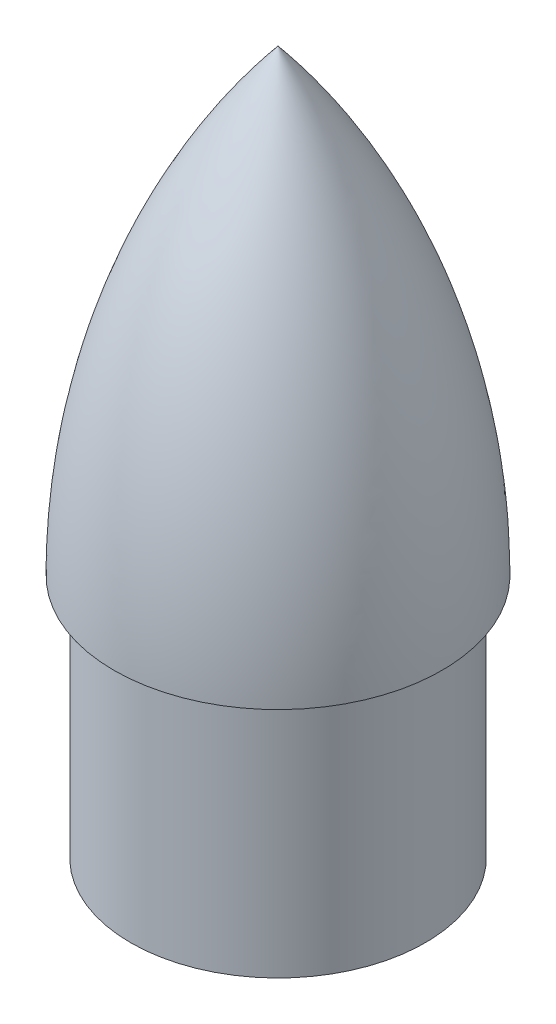
ISO-10303-21;
HEADER;
FILE_DESCRIPTION(('STEP AP214'),'2;1');
FILE_NAME('part.step','',(''),(''),'','','');
FILE_SCHEMA(('AUTOMOTIVE_DESIGN { 1 0 10303 214 1 1 1 1 }'));
ENDSEC;
DATA;
#1=APPLICATION_CONTEXT('core data for automotive mechanical design processes');
#2=APPLICATION_PROTOCOL_DEFINITION('international standard','automotive_design',2000,#1);
#3=PRODUCT_CONTEXT('',#1,'mechanical');
#4=PRODUCT('Part','Part','',(#3));
#5=PRODUCT_RELATED_PRODUCT_CATEGORY('part','',(#4));
#6=PRODUCT_DEFINITION_FORMATION('','',#4);
#7=PRODUCT_DEFINITION_CONTEXT('part definition',#1,'design');
#8=PRODUCT_DEFINITION('design','',#6,#7);
#9=PRODUCT_DEFINITION_SHAPE('','',#8);
#10=(LENGTH_UNIT() NAMED_UNIT(*) SI_UNIT(.MILLI.,.METRE.));
#11=(NAMED_UNIT(*) PLANE_ANGLE_UNIT() SI_UNIT($,.RADIAN.));
#12=(NAMED_UNIT(*) SI_UNIT($,.STERADIAN.) SOLID_ANGLE_UNIT());
#13=UNCERTAINTY_MEASURE_WITH_UNIT(LENGTH_MEASURE(1.E-05),#10,'distance_accuracy_value','');
#14=(GEOMETRIC_REPRESENTATION_CONTEXT(3) GLOBAL_UNCERTAINTY_ASSIGNED_CONTEXT((#13)) GLOBAL_UNIT_ASSIGNED_CONTEXT((#10,
#11,#12)) REPRESENTATION_CONTEXT('',''));
#15=CARTESIAN_POINT('',(0.,0.,0.));
#16=DIRECTION('',(0.,0.,1.));
#17=DIRECTION('',(1.,0.,0.));
#18=AXIS2_PLACEMENT_3D('',#15,#16,#17);
#19=CARTESIAN_POINT('',(0.,0.,0.));
#20=DIRECTION('',(0.,-1.,0.));
#21=DIRECTION('',(0.,0.,-1.));
#22=AXIS2_PLACEMENT_3D('',#19,#20,#21);
#23=PLANE('',#22);
#24=CARTESIAN_POINT('',(0.,0.,0.));
#25=DIRECTION('',(0.,-1.,0.));
#26=DIRECTION('',(0.,0.,-1.));
#27=AXIS2_PLACEMENT_3D('',#24,#25,#26);
#28=CIRCLE('',#27,30.15);
#29=CARTESIAN_POINT('',(0.,0.,-30.15));
#30=VERTEX_POINT('',#29);
#31=EDGE_CURVE('E65',#30,#30,#28,.T.);
#32=ORIENTED_EDGE('',*,*,#31,.F.);
#33=EDGE_LOOP('',(#32));
#34=FACE_BOUND('',#33,.T.);
#35=CARTESIAN_POINT('',(0.,0.,0.));
#36=DIRECTION('',(0.,-1.,0.));
#37=DIRECTION('',(0.,0.,-1.));
#38=AXIS2_PLACEMENT_3D('',#35,#36,#37);
#39=CIRCLE('',#38,33.570889043);
#40=CARTESIAN_POINT('',(0.,0.,-33.570889043));
#41=VERTEX_POINT('',#40);
#42=EDGE_CURVE('E59',#41,#41,#39,.T.);
#43=ORIENTED_EDGE('',*,*,#42,.T.);
#44=EDGE_LOOP('',(#43));
#45=FACE_BOUND('',#44,.T.);
#46=ADVANCED_FACE('F41',(#34,#45),#23,.T.);
#47=CARTESIAN_POINT('',(0.,0.,114.536814902525));
#48=DIRECTION('',(-1.,0.,0.));
#49=DIRECTION('',(0.,0.,-1.));
#50=AXIS2_PLACEMENT_3D('',#47,#48,#49);
#51=CIRCLE('',#50,148.107703945525);
#52=TRIMMED_CURVE('',#51,(PARAMETER_VALUE(-0.686712247406567)),
(PARAMETER_VALUE(0.686712247406567)),.T.,.PARAMETER.);
#53=CARTESIAN_POINT('',(0.,0.,0.));
#54=DIRECTION('',(0.,-1.,0.));
#55=AXIS1_PLACEMENT('',#53,#54);
#56=SURFACE_OF_REVOLUTION('',#52,#55);
#57=CARTESIAN_POINT('',(0.,93.9,0.));
#58=VERTEX_POINT('',#57);
#59=VERTEX_LOOP('',#58);
#60=FACE_BOUND('',#59,.T.);
#61=ORIENTED_EDGE('',*,*,#42,.F.);
#62=EDGE_LOOP('',(#61));
#63=FACE_BOUND('',#62,.T.);
#64=ADVANCED_FACE('F52',(#60,#63),#56,.T.);
#65=CARTESIAN_POINT('',(0.,-50.,0.));
#66=DIRECTION('',(0.,1.,0.));
#67=DIRECTION('',(0.,0.,1.));
#68=AXIS2_PLACEMENT_3D('',#65,#66,#67);
#69=CYLINDRICAL_SURFACE('',#68,30.15);
#70=CARTESIAN_POINT('',(0.,-50.,0.));
#71=DIRECTION('',(0.,-1.,0.));
#72=DIRECTION('',(0.,0.,-1.));
#73=AXIS2_PLACEMENT_3D('',#70,#71,#72);
#74=CIRCLE('',#73,30.15);
#75=CARTESIAN_POINT('',(0.,-50.,-30.15));
#76=VERTEX_POINT('',#75);
#77=EDGE_CURVE('E61',#76,#76,#74,.T.);
#78=ORIENTED_EDGE('',*,*,#77,.F.);
#79=EDGE_LOOP('',(#78));
#80=FACE_BOUND('',#79,.T.);
#81=ORIENTED_EDGE('',*,*,#31,.T.);
#82=EDGE_LOOP('',(#81));
#83=FACE_BOUND('',#82,.T.);
#84=ADVANCED_FACE('F55',(#80,#83),#69,.T.);
#85=CARTESIAN_POINT('',(0.,-50.,0.));
#86=DIRECTION('',(0.,-1.,0.));
#87=DIRECTION('',(0.,0.,-1.));
#88=AXIS2_PLACEMENT_3D('',#85,#86,#87);
#89=PLANE('',#88);
#90=CARTESIAN_POINT('',(0.,-50.,0.));
#91=DIRECTION('',(0.,-1.,0.));
#92=DIRECTION('',(0.,0.,-1.));
#93=AXIS2_PLACEMENT_3D('',#90,#91,#92);
#94=CIRCLE('',#93,27.75);
#95=CARTESIAN_POINT('',(0.,-50.,-27.75));
#96=VERTEX_POINT('',#95);
#97=EDGE_CURVE('E69',#96,#96,#94,.T.);
#98=ORIENTED_EDGE('',*,*,#97,.F.);
#99=EDGE_LOOP('',(#98));
#100=FACE_BOUND('',#99,.T.);
#101=ORIENTED_EDGE('',*,*,#77,.T.);
#102=EDGE_LOOP('',(#101));
#103=FACE_BOUND('',#102,.T.);
#104=ADVANCED_FACE('F76',(#100,#103),#89,.T.);
#105=CARTESIAN_POINT('',(0.,13.,0.));
#106=DIRECTION('',(0.,-1.,0.));
#107=DIRECTION('',(0.,0.,-1.));
#108=AXIS2_PLACEMENT_3D('',#105,#106,#107);
#109=CYLINDRICAL_SURFACE('',#108,27.75);
#110=CARTESIAN_POINT('',(0.,3.00000000000002,0.));
#111=DIRECTION('',(0.,-1.,0.));
#112=DIRECTION('',(0.,0.,-1.));
#113=AXIS2_PLACEMENT_3D('',#110,#111,#112);
#114=CIRCLE('',#113,27.75);
#115=CARTESIAN_POINT('',(0.,3.00000000000002,-27.75));
#116=VERTEX_POINT('',#115);
#117=EDGE_CURVE('E11',#116,#116,#114,.F.);
#118=ORIENTED_EDGE('',*,*,#117,.T.);
#119=EDGE_LOOP('',(#118));
#120=FACE_BOUND('',#119,.T.);
#121=ORIENTED_EDGE('',*,*,#97,.T.);
#122=EDGE_LOOP('',(#121));
#123=FACE_BOUND('',#122,.T.);
#124=ADVANCED_FACE('F74',(#120,#123),#109,.F.);
#125=CARTESIAN_POINT('',(0.,13.,0.));
#126=DIRECTION('',(0.,-1.,0.));
#127=DIRECTION('',(0.,0.,-1.));
#128=AXIS2_PLACEMENT_3D('',#125,#126,#127);
#129=PLANE('',#128);
#130=CARTESIAN_POINT('',(0.,13.,0.));
#131=DIRECTION('',(0.,-1.,0.));
#132=DIRECTION('',(0.,0.,-1.));
#133=AXIS2_PLACEMENT_3D('',#130,#131,#132);
#134=CIRCLE('',#133,15.4010284346494);
#135=CARTESIAN_POINT('',(0.,13.,-15.4010284346494));
#136=VERTEX_POINT('',#135);
#137=EDGE_CURVE('E49',#136,#136,#134,.T.);
#138=ORIENTED_EDGE('',*,*,#137,.T.);
#139=EDGE_LOOP('',(#138));
#140=FACE_BOUND('',#139,.T.);
#141=ADVANCED_FACE('F93',(#140),#129,.T.);
#142=CARTESIAN_POINT('',(0.,13.,0.));
#143=DIRECTION('',(0.,-1.,0.));
#144=DIRECTION('',(0.,0.,-1.));
#145=AXIS2_PLACEMENT_3D('',#142,#143,#144);
#146=CONICAL_SURFACE('',#145,15.4010284346494,0.890117918517113);
#147=CARTESIAN_POINT('',(0.,3.00000000000002,-27.75));
#148=CARTESIAN_POINT('',(0.,3.10416666666669,-27.6213648795276));
#149=CARTESIAN_POINT('',(0.,3.20833333333336,-27.4927297590552));
#150=CARTESIAN_POINT('',(0.,3.41666666666669,-27.2354595181104));
#151=CARTESIAN_POINT('',(0.,3.52083333333335,-27.106824397638));
#152=CARTESIAN_POINT('',(0.,3.72916666666669,-26.8495541566932));
#153=CARTESIAN_POINT('',(0.,3.83333333333335,-26.7209190362208));
#154=CARTESIAN_POINT('',(0.,4.04166666666669,-26.463648795276));
#155=CARTESIAN_POINT('',(0.,4.14583333333335,-26.3350136748036));
#156=CARTESIAN_POINT('',(0.,4.35416666666669,-26.0777434338588));
#157=CARTESIAN_POINT('',(0.,4.45833333333335,-25.9491083133864));
#158=CARTESIAN_POINT('',(0.,4.66666666666669,-25.6918380724416));
#159=CARTESIAN_POINT('',(0.,4.77083333333335,-25.5632029519692));
#160=CARTESIAN_POINT('',(0.,4.97916666666669,-25.3059327110244));
#161=CARTESIAN_POINT('',(0.,5.08333333333335,-25.177297590552));
#162=CARTESIAN_POINT('',(0.,5.29166666666669,-24.9200273496072));
#163=CARTESIAN_POINT('',(0.,5.39583333333335,-24.7913922291348));
#164=CARTESIAN_POINT('',(0.,5.60416666666669,-24.5341219881899));
#165=CARTESIAN_POINT('',(0.,5.70833333333335,-24.4054868677175));
#166=CARTESIAN_POINT('',(0.,5.91666666666669,-24.1482166267727));
#167=CARTESIAN_POINT('',(0.,6.02083333333335,-24.0195815063003));
#168=CARTESIAN_POINT('',(0.,6.22916666666668,-23.7623112653555));
#169=CARTESIAN_POINT('',(0.,6.33333333333335,-23.6336761448831));
#170=CARTESIAN_POINT('',(0.,6.54166666666669,-23.3764059039383));
#171=CARTESIAN_POINT('',(0.,6.64583333333335,-23.2477707834659));
#172=CARTESIAN_POINT('',(0.,6.85416666666668,-22.9905005425211));
#173=CARTESIAN_POINT('',(0.,6.95833333333335,-22.8618654220487));
#174=CARTESIAN_POINT('',(0.,7.16666666666668,-22.6045951811039));
#175=CARTESIAN_POINT('',(0.,7.27083333333335,-22.4759600606315));
#176=CARTESIAN_POINT('',(0.,7.47916666666668,-22.2186898196867));
#177=CARTESIAN_POINT('',(0.,7.58333333333335,-22.0900546992143));
#178=CARTESIAN_POINT('',(0.,7.79166666666668,-21.8327844582695));
#179=CARTESIAN_POINT('',(0.,7.89583333333335,-21.7041493377971));
#180=CARTESIAN_POINT('',(0.,8.10416666666669,-21.4468790968523));
#181=CARTESIAN_POINT('',(0.,8.20833333333335,-21.3182439763799));
#182=CARTESIAN_POINT('',(0.,8.41666666666669,-21.0609737354351));
#183=CARTESIAN_POINT('',(0.,8.52083333333335,-20.9323386149627));
#184=CARTESIAN_POINT('',(0.,8.72916666666668,-20.6750683740179));
#185=CARTESIAN_POINT('',(0.,8.83333333333335,-20.5464332535455));
#186=CARTESIAN_POINT('',(0.,9.04166666666668,-20.2891630126007));
#187=CARTESIAN_POINT('',(0.,9.14583333333335,-20.1605278921283));
#188=CARTESIAN_POINT('',(0.,9.35416666666668,-19.9032576511835));
#189=CARTESIAN_POINT('',(0.,9.45833333333335,-19.7746225307111));
#190=CARTESIAN_POINT('',(0.,9.66666666666668,-19.5173522897663));
#191=CARTESIAN_POINT('',(0.,9.77083333333335,-19.3887171692939));
#192=CARTESIAN_POINT('',(0.,9.97916666666668,-19.131446928349));
#193=CARTESIAN_POINT('',(0.,10.0833333333333,-19.0028118078766));
#194=CARTESIAN_POINT('',(0.,10.2916666666667,-18.7455415669318));
#195=CARTESIAN_POINT('',(0.,10.3958333333333,-18.6169064464594));
#196=CARTESIAN_POINT('',(0.,10.6041666666667,-18.3596362055146));
#197=CARTESIAN_POINT('',(0.,10.7083333333333,-18.2310010850422));
#198=CARTESIAN_POINT('',(0.,10.9166666666667,-17.9737308440974));
#199=CARTESIAN_POINT('',(0.,11.0208333333333,-17.845095723625));
#200=CARTESIAN_POINT('',(0.,11.2291666666667,-17.5878254826802));
#201=CARTESIAN_POINT('',(0.,11.3333333333333,-17.4591903622078));
#202=CARTESIAN_POINT('',(0.,11.5416666666667,-17.201920121263));
#203=CARTESIAN_POINT('',(0.,11.6458333333333,-17.0732850007906));
#204=CARTESIAN_POINT('',(0.,11.8541666666667,-16.8160147598458));
#205=CARTESIAN_POINT('',(0.,11.9583333333333,-16.6873796393734));
#206=CARTESIAN_POINT('',(0.,12.1666666666667,-16.4301093984286));
#207=CARTESIAN_POINT('',(0.,12.2708333333333,-16.3014742779562));
#208=CARTESIAN_POINT('',(0.,12.4791666666667,-16.0442040370114));
#209=CARTESIAN_POINT('',(0.,12.5833333333333,-15.915568916539));
#210=CARTESIAN_POINT('',(0.,12.7916666666667,-15.6582986755942));
#211=CARTESIAN_POINT('',(0.,12.8958333333333,-15.5296635551218));
#212=CARTESIAN_POINT('',(0.,13.,-15.4010284346494));
#213=B_SPLINE_CURVE_WITH_KNOTS('',3,(#147,#148,#149,#150,#151,#152,#153,#154,#155,#156,#157,
#158,#159,#160,#161,#162,#163,#164,#165,#166,#167,#168,#169,#170,#171,#172,#173,#174,#175,#176,
#177,#178,#179,#180,#181,#182,#183,#184,#185,#186,#187,#188,#189,#190,#191,#192,#193,#194,#195,
#196,#197,#198,#199,#200,#201,#202,#203,#204,#205,#206,#207,#208,#209,#210,#211,#212),
.UNSPECIFIED.,.F.,.F.,(4,2,2,2,2,2,2,2,2,2,2,2,2,2,2,2,2,2,2,2,2,2,2,2,2,2,2,2,2,2,2,2,4),(0.,
0.49656741533305,0.993134830666096,1.48970224599915,1.9862696613322,2.48283707666525,
2.97940449199829,3.47597190733134,3.97253932266439,4.46910673799744,4.96567415333049,
5.46224156866354,5.95880898399659,6.45537639932964,6.95194381466269,7.44851122999574,
7.94507864532878,8.44164606066183,8.93821347599488,9.43478089132793,9.93134830666098,
10.427915721994,10.9244831373271,11.4210505526601,11.9176179679932,12.4141853833262,
12.9107527986593,13.4073202139923,13.9038876293254,14.4004550446584,14.8970224599915,
15.3935898753245,15.8901572906576),.UNSPECIFIED.);
#214=EDGE_CURVE('BSEAM44',#116,#136,#213,.T.);
#215=ORIENTED_EDGE('',*,*,#117,.F.);
#216=ORIENTED_EDGE('',*,*,#137,.F.);
#217=ORIENTED_EDGE('',*,*,#214,.T.);
#218=ORIENTED_EDGE('',*,*,#214,.F.);
#219=EDGE_LOOP('',(#215,#217,#216,#218));
#220=FACE_BOUND('',#219,.T.);
#221=ADVANCED_FACE('F44',(#220),#146,.F.);
#222=CLOSED_SHELL('',(#46,#64,#84,#104,#124,#141,#221));
#223=MANIFOLD_SOLID_BREP('B2',#222);
#224=ADVANCED_BREP_SHAPE_REPRESENTATION('',(#18,#223),#14);
#225=SHAPE_DEFINITION_REPRESENTATION(#9,#224);
ENDSEC;
END-ISO-10303-21;
